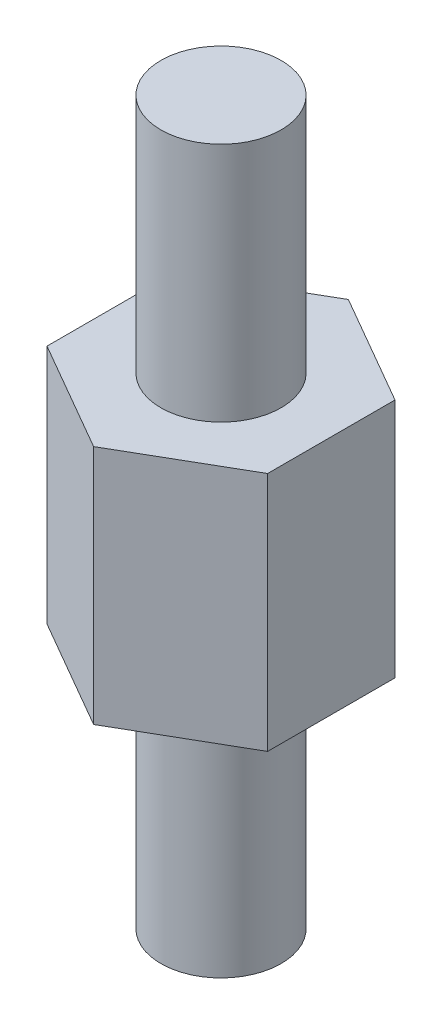
ISO-10303-21;
HEADER;
FILE_DESCRIPTION(('STEP AP214'),'2;1');
FILE_NAME('part.step','',(''),(''),'','','');
FILE_SCHEMA(('AUTOMOTIVE_DESIGN { 1 0 10303 214 1 1 1 1 }'));
ENDSEC;
DATA;
#1=APPLICATION_CONTEXT('core data for automotive mechanical design processes');
#2=APPLICATION_PROTOCOL_DEFINITION('international standard','automotive_design',2000,#1);
#3=PRODUCT_CONTEXT('',#1,'mechanical');
#4=PRODUCT('Part','Part','',(#3));
#5=PRODUCT_RELATED_PRODUCT_CATEGORY('part','',(#4));
#6=PRODUCT_DEFINITION_FORMATION('','',#4);
#7=PRODUCT_DEFINITION_CONTEXT('part definition',#1,'design');
#8=PRODUCT_DEFINITION('design','',#6,#7);
#9=PRODUCT_DEFINITION_SHAPE('','',#8);
#10=(LENGTH_UNIT() NAMED_UNIT(*) SI_UNIT(.MILLI.,.METRE.));
#11=(NAMED_UNIT(*) PLANE_ANGLE_UNIT() SI_UNIT($,.RADIAN.));
#12=(NAMED_UNIT(*) SI_UNIT($,.STERADIAN.) SOLID_ANGLE_UNIT());
#13=UNCERTAINTY_MEASURE_WITH_UNIT(LENGTH_MEASURE(1.E-05),#10,'distance_accuracy_value','');
#14=(GEOMETRIC_REPRESENTATION_CONTEXT(3) GLOBAL_UNCERTAINTY_ASSIGNED_CONTEXT((#13)) GLOBAL_UNIT_ASSIGNED_CONTEXT((#10,
#11,#12)) REPRESENTATION_CONTEXT('',''));
#15=CARTESIAN_POINT('',(0.,0.,0.));
#16=DIRECTION('',(0.,0.,1.));
#17=DIRECTION('',(1.,0.,0.));
#18=AXIS2_PLACEMENT_3D('',#15,#16,#17);
#19=CARTESIAN_POINT('',(0.,12.,0.));
#20=DIRECTION('',(0.,-1.,0.));
#21=DIRECTION('',(0.,0.,-1.));
#22=AXIS2_PLACEMENT_3D('',#19,#20,#21);
#23=CYLINDRICAL_SURFACE('',#22,1.5);
#24=CARTESIAN_POINT('',(0.,12.,0.));
#25=DIRECTION('',(0.,1.,0.));
#26=DIRECTION('',(0.,0.,1.));
#27=AXIS2_PLACEMENT_3D('',#24,#25,#26);
#28=CIRCLE('',#27,1.5);
#29=CARTESIAN_POINT('',(0.,12.,1.5));
#30=VERTEX_POINT('',#29);
#31=EDGE_CURVE('E11',#30,#30,#28,.T.);
#32=ORIENTED_EDGE('',*,*,#31,.F.);
#33=EDGE_LOOP('',(#32));
#34=FACE_BOUND('',#33,.T.);
#35=CARTESIAN_POINT('',(0.,6.,0.));
#36=DIRECTION('',(0.,1.,0.));
#37=DIRECTION('',(0.,0.,1.));
#38=AXIS2_PLACEMENT_3D('',#35,#36,#37);
#39=CIRCLE('',#38,1.5);
#40=CARTESIAN_POINT('',(0.,6.,1.5));
#41=VERTEX_POINT('',#40);
#42=EDGE_CURVE('E50',#41,#41,#39,.T.);
#43=ORIENTED_EDGE('',*,*,#42,.T.);
#44=EDGE_LOOP('',(#43));
#45=FACE_BOUND('',#44,.T.);
#46=ADVANCED_FACE('F47',(#34,#45),#23,.T.);
#47=CARTESIAN_POINT('',(0.,12.,0.));
#48=DIRECTION('',(0.,1.,0.));
#49=DIRECTION('',(0.,0.,1.));
#50=AXIS2_PLACEMENT_3D('',#47,#48,#49);
#51=PLANE('',#50);
#52=ORIENTED_EDGE('',*,*,#31,.T.);
#53=EDGE_LOOP('',(#52));
#54=FACE_BOUND('',#53,.T.);
#55=ADVANCED_FACE('F62',(#54),#51,.T.);
#56=CARTESIAN_POINT('',(0.,6.,0.));
#57=DIRECTION('',(0.,1.,0.));
#58=DIRECTION('',(0.,0.,1.));
#59=AXIS2_PLACEMENT_3D('',#56,#57,#58);
#60=PLANE('',#59);
#61=ORIENTED_EDGE('',*,*,#42,.F.);
#62=EDGE_LOOP('',(#61));
#63=FACE_BOUND('',#62,.T.);
#64=ADVANCED_FACE('F60',(#63),#60,.F.);
#65=CLOSED_SHELL('',(#46,#55,#64));
#66=MANIFOLD_SOLID_BREP('B2',#65);
#67=CARTESIAN_POINT('',(-2.74999999999998,6.,1.5877132402715));
#68=DIRECTION('',(0.499999999999995,0.,-0.866025403784441));
#69=DIRECTION('',(-0.866025403784442,0.,-0.499999999999995));
#70=AXIS2_PLACEMENT_3D('',#67,#68,#69);
#71=PLANE('',#70);
#72=DIRECTION('',(0.866025403784442,0.,0.499999999999995));
#73=VECTOR('',#72,1.);
#74=CARTESIAN_POINT('',(-2.74999999999998,0.,1.5877132402715));
#75=LINE('',#74,#73);
#76=CARTESIAN_POINT('',(-2.74999999999998,0.,1.5877132402715));
#77=VERTEX_POINT('',#76);
#78=CARTESIAN_POINT('',(0.,0.,3.17542648054294));
#79=VERTEX_POINT('',#78);
#80=EDGE_CURVE('E179',#77,#79,#75,.T.);
#81=ORIENTED_EDGE('',*,*,#80,.T.);
#82=DIRECTION('',(0.,-1.,0.));
#83=VECTOR('',#82,1.);
#84=CARTESIAN_POINT('',(0.,6.,3.17542648054294));
#85=LINE('',#84,#83);
#86=CARTESIAN_POINT('',(0.,6.,3.17542648054294));
#87=VERTEX_POINT('',#86);
#88=EDGE_CURVE('E91',#87,#79,#85,.T.);
#89=ORIENTED_EDGE('',*,*,#88,.F.);
#90=DIRECTION('',(0.866025403784442,0.,0.499999999999995));
#91=VECTOR('',#90,1.);
#92=CARTESIAN_POINT('',(-2.74999999999998,6.,1.5877132402715));
#93=LINE('',#92,#91);
#94=CARTESIAN_POINT('',(-2.74999999999998,6.,1.5877132402715));
#95=VERTEX_POINT('',#94);
#96=EDGE_CURVE('E196',#95,#87,#93,.T.);
#97=ORIENTED_EDGE('',*,*,#96,.F.);
#98=DIRECTION('',(0.,-1.,0.));
#99=VECTOR('',#98,1.);
#100=CARTESIAN_POINT('',(-2.74999999999998,6.,1.5877132402715));
#101=LINE('',#100,#99);
#102=EDGE_CURVE('E175',#95,#77,#101,.T.);
#103=ORIENTED_EDGE('',*,*,#102,.T.);
#104=EDGE_LOOP('',(#81,#89,#97,#103));
#105=FACE_BOUND('',#104,.T.);
#106=ADVANCED_FACE('F88',(#105),#71,.F.);
#107=CARTESIAN_POINT('',(0.,6.,3.17542648054294));
#108=DIRECTION('',(-0.500000000000001,0.,-0.866025403784438));
#109=DIRECTION('',(-0.866025403784438,0.,0.500000000000001));
#110=AXIS2_PLACEMENT_3D('',#107,#108,#109);
#111=PLANE('',#110);
#112=DIRECTION('',(0.866025403784438,0.,-0.500000000000001));
#113=VECTOR('',#112,1.);
#114=CARTESIAN_POINT('',(0.,0.,3.17542648054294));
#115=LINE('',#114,#113);
#116=CARTESIAN_POINT('',(2.75000000000001,0.,1.58771324027147));
#117=VERTEX_POINT('',#116);
#118=EDGE_CURVE('E183',#79,#117,#115,.T.);
#119=ORIENTED_EDGE('',*,*,#118,.T.);
#120=DIRECTION('',(0.,-1.,0.));
#121=VECTOR('',#120,1.);
#122=CARTESIAN_POINT('',(2.75000000000001,6.,1.58771324027147));
#123=LINE('',#122,#121);
#124=CARTESIAN_POINT('',(2.75000000000001,6.,1.58771324027147));
#125=VERTEX_POINT('',#124);
#126=EDGE_CURVE('E202',#125,#117,#123,.T.);
#127=ORIENTED_EDGE('',*,*,#126,.F.);
#128=DIRECTION('',(0.866025403784438,0.,-0.500000000000001));
#129=VECTOR('',#128,1.);
#130=CARTESIAN_POINT('',(0.,6.,3.17542648054294));
#131=LINE('',#130,#129);
#132=EDGE_CURVE('E144',#87,#125,#131,.T.);
#133=ORIENTED_EDGE('',*,*,#132,.F.);
#134=ORIENTED_EDGE('',*,*,#88,.T.);
#135=EDGE_LOOP('',(#119,#127,#133,#134));
#136=FACE_BOUND('',#135,.T.);
#137=ADVANCED_FACE('F209',(#136),#111,.F.);
#138=CARTESIAN_POINT('',(2.75000000000001,6.,1.58771324027147));
#139=DIRECTION('',(-1.,0.,0.));
#140=DIRECTION('',(0.,0.,1.));
#141=AXIS2_PLACEMENT_3D('',#138,#139,#140);
#142=PLANE('',#141);
#143=DIRECTION('',(0.,0.,-1.));
#144=VECTOR('',#143,1.);
#145=CARTESIAN_POINT('',(2.75000000000001,0.,1.58771324027147));
#146=LINE('',#145,#144);
#147=CARTESIAN_POINT('',(2.75,0.,-1.58771324027148));
#148=VERTEX_POINT('',#147);
#149=EDGE_CURVE('E187',#117,#148,#146,.T.);
#150=ORIENTED_EDGE('',*,*,#149,.T.);
#151=DIRECTION('',(0.,-1.,0.));
#152=VECTOR('',#151,1.);
#153=CARTESIAN_POINT('',(2.75,6.,-1.58771324027148));
#154=LINE('',#153,#152);
#155=CARTESIAN_POINT('',(2.75,6.,-1.58771324027148));
#156=VERTEX_POINT('',#155);
#157=EDGE_CURVE('E168',#156,#148,#154,.T.);
#158=ORIENTED_EDGE('',*,*,#157,.F.);
#159=DIRECTION('',(0.,0.,-1.));
#160=VECTOR('',#159,1.);
#161=CARTESIAN_POINT('',(2.75000000000001,6.,1.58771324027147));
#162=LINE('',#161,#160);
#163=EDGE_CURVE('E157',#125,#156,#162,.T.);
#164=ORIENTED_EDGE('',*,*,#163,.F.);
#165=ORIENTED_EDGE('',*,*,#126,.T.);
#166=EDGE_LOOP('',(#150,#158,#164,#165));
#167=FACE_BOUND('',#166,.T.);
#168=ADVANCED_FACE('F215',(#167),#142,.F.);
#169=CARTESIAN_POINT('',(2.75,6.,-1.58771324027148));
#170=DIRECTION('',(-0.499999999999995,0.,0.866025403784442));
#171=DIRECTION('',(0.866025403784442,0.,0.499999999999995));
#172=AXIS2_PLACEMENT_3D('',#169,#170,#171);
#173=PLANE('',#172);
#174=DIRECTION('',(-0.866025403784442,0.,-0.499999999999995));
#175=VECTOR('',#174,1.);
#176=CARTESIAN_POINT('',(2.75,0.,-1.58771324027148));
#177=LINE('',#176,#175);
#178=CARTESIAN_POINT('',(0.,0.,-3.17542648054294));
#179=VERTEX_POINT('',#178);
#180=EDGE_CURVE('E166',#148,#179,#177,.T.);
#181=ORIENTED_EDGE('',*,*,#180,.T.);
#182=DIRECTION('',(0.,-1.,0.));
#183=VECTOR('',#182,1.);
#184=CARTESIAN_POINT('',(0.,6.,-3.17542648054294));
#185=LINE('',#184,#183);
#186=CARTESIAN_POINT('',(0.,6.,-3.17542648054294));
#187=VERTEX_POINT('',#186);
#188=EDGE_CURVE('E163',#187,#179,#185,.T.);
#189=ORIENTED_EDGE('',*,*,#188,.F.);
#190=DIRECTION('',(-0.866025403784442,0.,-0.499999999999995));
#191=VECTOR('',#190,1.);
#192=CARTESIAN_POINT('',(2.75,6.,-1.58771324027148));
#193=LINE('',#192,#191);
#194=EDGE_CURVE('E151',#156,#187,#193,.T.);
#195=ORIENTED_EDGE('',*,*,#194,.F.);
#196=ORIENTED_EDGE('',*,*,#157,.T.);
#197=EDGE_LOOP('',(#181,#189,#195,#196));
#198=FACE_BOUND('',#197,.T.);
#199=ADVANCED_FACE('F164',(#198),#173,.F.);
#200=CARTESIAN_POINT('',(0.,6.,-3.17542648054294));
#201=DIRECTION('',(0.500000000000007,0.,0.866025403784434));
#202=DIRECTION('',(0.866025403784435,0.,-0.500000000000007));
#203=AXIS2_PLACEMENT_3D('',#200,#201,#202);
#204=PLANE('',#203);
#205=DIRECTION('',(-0.866025403784435,0.,0.500000000000007));
#206=VECTOR('',#205,1.);
#207=CARTESIAN_POINT('',(0.,0.,-3.17542648054294));
#208=LINE('',#207,#206);
#209=CARTESIAN_POINT('',(-2.75000000000002,0.,-1.58771324027145));
#210=VERTEX_POINT('',#209);
#211=EDGE_CURVE('E129',#179,#210,#208,.T.);
#212=ORIENTED_EDGE('',*,*,#211,.T.);
#213=DIRECTION('',(0.,-1.,0.));
#214=VECTOR('',#213,1.);
#215=CARTESIAN_POINT('',(-2.75000000000002,6.,-1.58771324027145));
#216=LINE('',#215,#214);
#217=CARTESIAN_POINT('',(-2.75000000000002,6.,-1.58771324027145));
#218=VERTEX_POINT('',#217);
#219=EDGE_CURVE('E169',#218,#210,#216,.T.);
#220=ORIENTED_EDGE('',*,*,#219,.F.);
#221=DIRECTION('',(-0.866025403784435,0.,0.500000000000007));
#222=VECTOR('',#221,1.);
#223=CARTESIAN_POINT('',(0.,6.,-3.17542648054294));
#224=LINE('',#223,#222);
#225=EDGE_CURVE('E155',#187,#218,#224,.T.);
#226=ORIENTED_EDGE('',*,*,#225,.F.);
#227=ORIENTED_EDGE('',*,*,#188,.T.);
#228=EDGE_LOOP('',(#212,#220,#226,#227));
#229=FACE_BOUND('',#228,.T.);
#230=ADVANCED_FACE('F171',(#229),#204,.F.);
#231=CARTESIAN_POINT('',(-2.75000000000002,6.,-1.58771324027145));
#232=DIRECTION('',(1.,0.,0.));
#233=DIRECTION('',(0.,0.,-1.));
#234=AXIS2_PLACEMENT_3D('',#231,#232,#233);
#235=PLANE('',#234);
#236=DIRECTION('',(0.,0.,1.));
#237=VECTOR('',#236,1.);
#238=CARTESIAN_POINT('',(-2.75000000000002,0.,-1.58771324027145));
#239=LINE('',#238,#237);
#240=EDGE_CURVE('E135',#210,#77,#239,.T.);
#241=ORIENTED_EDGE('',*,*,#240,.T.);
#242=ORIENTED_EDGE('',*,*,#102,.F.);
#243=DIRECTION('',(0.,0.,1.));
#244=VECTOR('',#243,1.);
#245=CARTESIAN_POINT('',(-2.75000000000002,6.,-1.58771324027145));
#246=LINE('',#245,#244);
#247=EDGE_CURVE('E106',#218,#95,#246,.T.);
#248=ORIENTED_EDGE('',*,*,#247,.F.);
#249=ORIENTED_EDGE('',*,*,#219,.T.);
#250=EDGE_LOOP('',(#241,#242,#248,#249));
#251=FACE_BOUND('',#250,.T.);
#252=ADVANCED_FACE('F239',(#251),#235,.F.);
#253=CARTESIAN_POINT('',(0.,6.,0.));
#254=DIRECTION('',(0.,1.,0.));
#255=DIRECTION('',(0.,0.,1.));
#256=AXIS2_PLACEMENT_3D('',#253,#254,#255);
#257=PLANE('',#256);
#258=ORIENTED_EDGE('',*,*,#96,.T.);
#259=ORIENTED_EDGE('',*,*,#132,.T.);
#260=ORIENTED_EDGE('',*,*,#163,.T.);
#261=ORIENTED_EDGE('',*,*,#194,.T.);
#262=ORIENTED_EDGE('',*,*,#225,.T.);
#263=ORIENTED_EDGE('',*,*,#247,.T.);
#264=EDGE_LOOP('',(#258,#259,#260,#261,#262,#263));
#265=FACE_BOUND('',#264,.T.);
#266=ADVANCED_FACE('F153',(#265),#257,.T.);
#267=CARTESIAN_POINT('',(0.,0.,0.));
#268=DIRECTION('',(0.,1.,0.));
#269=DIRECTION('',(0.,0.,1.));
#270=AXIS2_PLACEMENT_3D('',#267,#268,#269);
#271=PLANE('',#270);
#272=CARTESIAN_POINT('',(0.,0.,0.));
#273=DIRECTION('',(0.,-1.,0.));
#274=DIRECTION('',(0.,0.,-1.));
#275=AXIS2_PLACEMENT_3D('',#272,#273,#274);
#276=CIRCLE('',#275,1.5);
#277=CARTESIAN_POINT('',(0.,0.,-1.5));
#278=VERTEX_POINT('',#277);
#279=EDGE_CURVE('E45',#278,#278,#276,.T.);
#280=ORIENTED_EDGE('',*,*,#279,.F.);
#281=EDGE_LOOP('',(#280));
#282=FACE_BOUND('',#281,.T.);
#283=ORIENTED_EDGE('',*,*,#80,.F.);
#284=ORIENTED_EDGE('',*,*,#240,.F.);
#285=ORIENTED_EDGE('',*,*,#211,.F.);
#286=ORIENTED_EDGE('',*,*,#180,.F.);
#287=ORIENTED_EDGE('',*,*,#149,.F.);
#288=ORIENTED_EDGE('',*,*,#118,.F.);
#289=EDGE_LOOP('',(#283,#284,#285,#286,#287,#288));
#290=FACE_BOUND('',#289,.T.);
#291=ADVANCED_FACE('F214',(#282,#290),#271,.F.);
#292=CARTESIAN_POINT('',(0.,-6.,0.));
#293=DIRECTION('',(0.,1.,0.));
#294=DIRECTION('',(0.,0.,1.));
#295=AXIS2_PLACEMENT_3D('',#292,#293,#294);
#296=CYLINDRICAL_SURFACE('',#295,1.5);
#297=CARTESIAN_POINT('',(0.,-6.,0.));
#298=DIRECTION('',(0.,-1.,0.));
#299=DIRECTION('',(0.,0.,-1.));
#300=AXIS2_PLACEMENT_3D('',#297,#298,#299);
#301=CIRCLE('',#300,1.5);
#302=CARTESIAN_POINT('',(0.,-6.,-1.5));
#303=VERTEX_POINT('',#302);
#304=EDGE_CURVE('E184',#303,#303,#301,.T.);
#305=ORIENTED_EDGE('',*,*,#304,.F.);
#306=EDGE_LOOP('',(#305));
#307=FACE_BOUND('',#306,.T.);
#308=ORIENTED_EDGE('',*,*,#279,.T.);
#309=EDGE_LOOP('',(#308));
#310=FACE_BOUND('',#309,.T.);
#311=ADVANCED_FACE('F228',(#307,#310),#296,.T.);
#312=CARTESIAN_POINT('',(0.,-6.,0.));
#313=DIRECTION('',(0.,-1.,0.));
#314=DIRECTION('',(0.,0.,-1.));
#315=AXIS2_PLACEMENT_3D('',#312,#313,#314);
#316=PLANE('',#315);
#317=ORIENTED_EDGE('',*,*,#304,.T.);
#318=EDGE_LOOP('',(#317));
#319=FACE_BOUND('',#318,.T.);
#320=ADVANCED_FACE('F226',(#319),#316,.T.);
#321=CLOSED_SHELL('',(#106,#137,#168,#199,#230,#252,#266,#291,#311,#320));
#322=MANIFOLD_SOLID_BREP('B6',#321);
#323=ADVANCED_BREP_SHAPE_REPRESENTATION('',(#18,#66,#322),#14);
#324=SHAPE_DEFINITION_REPRESENTATION(#9,#323);
ENDSEC;
END-ISO-10303-21;
